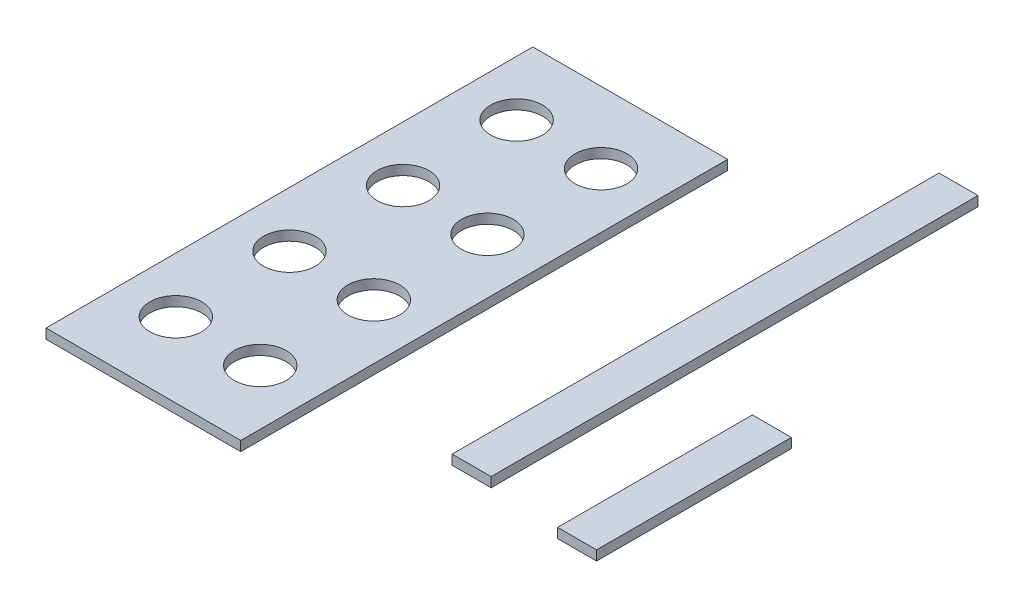
ISO-10303-21;
HEADER;
FILE_DESCRIPTION(('STEP AP214'),'2;1');
FILE_NAME('part.step','',(''),(''),'','','');
FILE_SCHEMA(('AUTOMOTIVE_DESIGN { 1 0 10303 214 1 1 1 1 }'));
ENDSEC;
DATA;
#1=APPLICATION_CONTEXT('core data for automotive mechanical design processes');
#2=APPLICATION_PROTOCOL_DEFINITION('international standard','automotive_design',2000,#1);
#3=PRODUCT_CONTEXT('',#1,'mechanical');
#4=PRODUCT('Part','Part','',(#3));
#5=PRODUCT_RELATED_PRODUCT_CATEGORY('part','',(#4));
#6=PRODUCT_DEFINITION_FORMATION('','',#4);
#7=PRODUCT_DEFINITION_CONTEXT('part definition',#1,'design');
#8=PRODUCT_DEFINITION('design','',#6,#7);
#9=PRODUCT_DEFINITION_SHAPE('','',#8);
#10=(LENGTH_UNIT() NAMED_UNIT(*) SI_UNIT(.MILLI.,.METRE.));
#11=(NAMED_UNIT(*) PLANE_ANGLE_UNIT() SI_UNIT($,.RADIAN.));
#12=(NAMED_UNIT(*) SI_UNIT($,.STERADIAN.) SOLID_ANGLE_UNIT());
#13=UNCERTAINTY_MEASURE_WITH_UNIT(LENGTH_MEASURE(1.E-05),#10,'distance_accuracy_value','');
#14=(GEOMETRIC_REPRESENTATION_CONTEXT(3) GLOBAL_UNCERTAINTY_ASSIGNED_CONTEXT((#13)) GLOBAL_UNIT_ASSIGNED_CONTEXT((#10,
#11,#12)) REPRESENTATION_CONTEXT('',''));
#15=CARTESIAN_POINT('',(0.,0.,0.));
#16=DIRECTION('',(0.,0.,1.));
#17=DIRECTION('',(1.,0.,0.));
#18=AXIS2_PLACEMENT_3D('',#15,#16,#17);
#19=CARTESIAN_POINT('',(93.6295601744686,3.,-73.2668198204584));
#20=DIRECTION('',(1.,0.,0.));
#21=DIRECTION('',(0.,0.,-1.));
#22=AXIS2_PLACEMENT_3D('',#19,#20,#21);
#23=PLANE('',#22);
#24=DIRECTION('',(0.,0.,1.));
#25=VECTOR('',#24,1.);
#26=CARTESIAN_POINT('',(93.6295601744686,0.,-73.2668198204584));
#27=LINE('',#26,#25);
#28=CARTESIAN_POINT('',(93.6295601744686,0.,-73.2668198204584));
#29=VERTEX_POINT('',#28);
#30=CARTESIAN_POINT('',(93.6295601744686,0.,-13.2668198204584));
#31=VERTEX_POINT('',#30);
#32=EDGE_CURVE('E107',#29,#31,#27,.T.);
#33=ORIENTED_EDGE('',*,*,#32,.T.);
#34=DIRECTION('',(0.,-1.,0.));
#35=VECTOR('',#34,1.);
#36=CARTESIAN_POINT('',(93.6295601744686,3.,-13.2668198204584));
#37=LINE('',#36,#35);
#38=CARTESIAN_POINT('',(93.6295601744686,3.,-13.2668198204584));
#39=VERTEX_POINT('',#38);
#40=EDGE_CURVE('E12',#39,#31,#37,.T.);
#41=ORIENTED_EDGE('',*,*,#40,.F.);
#42=DIRECTION('',(0.,0.,1.));
#43=VECTOR('',#42,1.);
#44=CARTESIAN_POINT('',(93.6295601744686,3.,-73.2668198204584));
#45=LINE('',#44,#43);
#46=CARTESIAN_POINT('',(93.6295601744686,3.,-73.2668198204584));
#47=VERTEX_POINT('',#46);
#48=EDGE_CURVE('E95',#47,#39,#45,.T.);
#49=ORIENTED_EDGE('',*,*,#48,.F.);
#50=DIRECTION('',(0.,-1.,0.));
#51=VECTOR('',#50,1.);
#52=CARTESIAN_POINT('',(93.6295601744686,3.,-73.2668198204584));
#53=LINE('',#52,#51);
#54=EDGE_CURVE('E103',#47,#29,#53,.T.);
#55=ORIENTED_EDGE('',*,*,#54,.T.);
#56=EDGE_LOOP('',(#33,#41,#49,#55));
#57=FACE_BOUND('',#56,.T.);
#58=ADVANCED_FACE('F44',(#57),#23,.F.);
#59=CARTESIAN_POINT('',(93.6295601744686,3.,-13.2668198204584));
#60=DIRECTION('',(0.,0.,-1.));
#61=DIRECTION('',(-1.,0.,0.));
#62=AXIS2_PLACEMENT_3D('',#59,#60,#61);
#63=PLANE('',#62);
#64=DIRECTION('',(1.,0.,0.));
#65=VECTOR('',#64,1.);
#66=CARTESIAN_POINT('',(93.6295601744686,0.,-13.2668198204584));
#67=LINE('',#66,#65);
#68=CARTESIAN_POINT('',(105.629560174469,0.,-13.2668198204584));
#69=VERTEX_POINT('',#68);
#70=EDGE_CURVE('E99',#31,#69,#67,.T.);
#71=ORIENTED_EDGE('',*,*,#70,.T.);
#72=DIRECTION('',(0.,-1.,0.));
#73=VECTOR('',#72,1.);
#74=CARTESIAN_POINT('',(105.629560174469,3.,-13.2668198204584));
#75=LINE('',#74,#73);
#76=CARTESIAN_POINT('',(105.629560174469,3.,-13.2668198204584));
#77=VERTEX_POINT('',#76);
#78=EDGE_CURVE('E52',#77,#69,#75,.T.);
#79=ORIENTED_EDGE('',*,*,#78,.F.);
#80=DIRECTION('',(1.,0.,0.));
#81=VECTOR('',#80,1.);
#82=CARTESIAN_POINT('',(93.6295601744686,3.,-13.2668198204584));
#83=LINE('',#82,#81);
#84=EDGE_CURVE('E90',#39,#77,#83,.T.);
#85=ORIENTED_EDGE('',*,*,#84,.F.);
#86=ORIENTED_EDGE('',*,*,#40,.T.);
#87=EDGE_LOOP('',(#71,#79,#85,#86));
#88=FACE_BOUND('',#87,.T.);
#89=ADVANCED_FACE('F98',(#88),#63,.F.);
#90=CARTESIAN_POINT('',(105.629560174469,3.,-73.2668198204584));
#91=DIRECTION('',(-1.,0.,0.));
#92=DIRECTION('',(0.,0.,1.));
#93=AXIS2_PLACEMENT_3D('',#90,#91,#92);
#94=PLANE('',#93);
#95=DIRECTION('',(0.,0.,-1.));
#96=VECTOR('',#95,1.);
#97=CARTESIAN_POINT('',(105.629560174469,0.,-73.2668198204584));
#98=LINE('',#97,#96);
#99=CARTESIAN_POINT('',(105.629560174469,0.,-73.2668198204584));
#100=VERTEX_POINT('',#99);
#101=EDGE_CURVE('E77',#69,#100,#98,.T.);
#102=ORIENTED_EDGE('',*,*,#101,.T.);
#103=DIRECTION('',(0.,-1.,0.));
#104=VECTOR('',#103,1.);
#105=CARTESIAN_POINT('',(105.629560174469,3.,-73.2668198204584));
#106=LINE('',#105,#104);
#107=CARTESIAN_POINT('',(105.629560174469,3.,-73.2668198204584));
#108=VERTEX_POINT('',#107);
#109=EDGE_CURVE('E100',#108,#100,#106,.T.);
#110=ORIENTED_EDGE('',*,*,#109,.F.);
#111=DIRECTION('',(0.,0.,-1.));
#112=VECTOR('',#111,1.);
#113=CARTESIAN_POINT('',(105.629560174469,3.,-73.2668198204584));
#114=LINE('',#113,#112);
#115=EDGE_CURVE('E93',#77,#108,#114,.T.);
#116=ORIENTED_EDGE('',*,*,#115,.F.);
#117=ORIENTED_EDGE('',*,*,#78,.T.);
#118=EDGE_LOOP('',(#102,#110,#116,#117));
#119=FACE_BOUND('',#118,.T.);
#120=ADVANCED_FACE('F101',(#119),#94,.F.);
#121=CARTESIAN_POINT('',(93.6295601744686,3.,-73.2668198204584));
#122=DIRECTION('',(0.,0.,1.));
#123=DIRECTION('',(1.,0.,0.));
#124=AXIS2_PLACEMENT_3D('',#121,#122,#123);
#125=PLANE('',#124);
#126=DIRECTION('',(-1.,0.,0.));
#127=VECTOR('',#126,1.);
#128=CARTESIAN_POINT('',(93.6295601744686,0.,-73.2668198204584));
#129=LINE('',#128,#127);
#130=EDGE_CURVE('E83',#100,#29,#129,.T.);
#131=ORIENTED_EDGE('',*,*,#130,.T.);
#132=ORIENTED_EDGE('',*,*,#54,.F.);
#133=DIRECTION('',(-1.,0.,0.));
#134=VECTOR('',#133,1.);
#135=CARTESIAN_POINT('',(93.6295601744686,3.,-73.2668198204584));
#136=LINE('',#135,#134);
#137=EDGE_CURVE('E60',#108,#47,#136,.T.);
#138=ORIENTED_EDGE('',*,*,#137,.F.);
#139=ORIENTED_EDGE('',*,*,#109,.T.);
#140=EDGE_LOOP('',(#131,#132,#138,#139));
#141=FACE_BOUND('',#140,.T.);
#142=ADVANCED_FACE('F114',(#141),#125,.F.);
#143=CARTESIAN_POINT('',(0.,3.,0.));
#144=DIRECTION('',(0.,1.,0.));
#145=DIRECTION('',(0.,0.,1.));
#146=AXIS2_PLACEMENT_3D('',#143,#144,#145);
#147=PLANE('',#146);
#148=ORIENTED_EDGE('',*,*,#48,.T.);
#149=ORIENTED_EDGE('',*,*,#84,.T.);
#150=ORIENTED_EDGE('',*,*,#115,.T.);
#151=ORIENTED_EDGE('',*,*,#137,.T.);
#152=EDGE_LOOP('',(#148,#149,#150,#151));
#153=FACE_BOUND('',#152,.T.);
#154=ADVANCED_FACE('F91',(#153),#147,.T.);
#155=CARTESIAN_POINT('',(0.,0.,0.));
#156=DIRECTION('',(0.,1.,0.));
#157=DIRECTION('',(0.,0.,1.));
#158=AXIS2_PLACEMENT_3D('',#155,#156,#157);
#159=PLANE('',#158);
#160=ORIENTED_EDGE('',*,*,#32,.F.);
#161=ORIENTED_EDGE('',*,*,#130,.F.);
#162=ORIENTED_EDGE('',*,*,#101,.F.);
#163=ORIENTED_EDGE('',*,*,#70,.F.);
#164=EDGE_LOOP('',(#160,#161,#162,#163));
#165=FACE_BOUND('',#164,.T.);
#166=ADVANCED_FACE('F117',(#165),#159,.F.);
#167=CLOSED_SHELL('',(#58,#89,#120,#142,#154,#166));
#168=MANIFOLD_SOLID_BREP('B2',#167);
#169=CARTESIAN_POINT('',(57.8362578566196,3.,-166.571847269674));
#170=DIRECTION('',(1.,0.,0.));
#171=DIRECTION('',(0.,0.,-1.));
#172=AXIS2_PLACEMENT_3D('',#169,#170,#171);
#173=PLANE('',#172);
#174=DIRECTION('',(0.,0.,1.));
#175=VECTOR('',#174,1.);
#176=CARTESIAN_POINT('',(57.8362578566196,0.,-166.571847269674));
#177=LINE('',#176,#175);
#178=CARTESIAN_POINT('',(57.8362578566196,0.,-166.571847269674));
#179=VERTEX_POINT('',#178);
#180=CARTESIAN_POINT('',(57.8362578566196,0.,-16.5718472696739));
#181=VERTEX_POINT('',#180);
#182=EDGE_CURVE('E240',#179,#181,#177,.T.);
#183=ORIENTED_EDGE('',*,*,#182,.T.);
#184=DIRECTION('',(0.,-1.,0.));
#185=VECTOR('',#184,1.);
#186=CARTESIAN_POINT('',(57.8362578566196,3.,-16.5718472696739));
#187=LINE('',#186,#185);
#188=CARTESIAN_POINT('',(57.8362578566196,3.,-16.5718472696739));
#189=VERTEX_POINT('',#188);
#190=EDGE_CURVE('E42',#189,#181,#187,.T.);
#191=ORIENTED_EDGE('',*,*,#190,.F.);
#192=DIRECTION('',(0.,0.,1.));
#193=VECTOR('',#192,1.);
#194=CARTESIAN_POINT('',(57.8362578566196,3.,-166.571847269674));
#195=LINE('',#194,#193);
#196=CARTESIAN_POINT('',(57.8362578566196,3.,-166.571847269674));
#197=VERTEX_POINT('',#196);
#198=EDGE_CURVE('E228',#197,#189,#195,.T.);
#199=ORIENTED_EDGE('',*,*,#198,.F.);
#200=DIRECTION('',(0.,-1.,0.));
#201=VECTOR('',#200,1.);
#202=CARTESIAN_POINT('',(57.8362578566196,3.,-166.571847269674));
#203=LINE('',#202,#201);
#204=EDGE_CURVE('E236',#197,#179,#203,.T.);
#205=ORIENTED_EDGE('',*,*,#204,.T.);
#206=EDGE_LOOP('',(#183,#191,#199,#205));
#207=FACE_BOUND('',#206,.T.);
#208=ADVANCED_FACE('F177',(#207),#173,.F.);
#209=CARTESIAN_POINT('',(57.8362578566196,3.,-16.5718472696739));
#210=DIRECTION('',(0.,0.,-1.));
#211=DIRECTION('',(-1.,0.,0.));
#212=AXIS2_PLACEMENT_3D('',#209,#210,#211);
#213=PLANE('',#212);
#214=DIRECTION('',(1.,0.,0.));
#215=VECTOR('',#214,1.);
#216=CARTESIAN_POINT('',(57.8362578566196,0.,-16.5718472696739));
#217=LINE('',#216,#215);
#218=CARTESIAN_POINT('',(69.8362578566196,0.,-16.5718472696739));
#219=VERTEX_POINT('',#218);
#220=EDGE_CURVE('E232',#181,#219,#217,.T.);
#221=ORIENTED_EDGE('',*,*,#220,.T.);
#222=DIRECTION('',(0.,-1.,0.));
#223=VECTOR('',#222,1.);
#224=CARTESIAN_POINT('',(69.8362578566196,3.,-16.5718472696739));
#225=LINE('',#224,#223);
#226=CARTESIAN_POINT('',(69.8362578566196,3.,-16.5718472696739));
#227=VERTEX_POINT('',#226);
#228=EDGE_CURVE('E185',#227,#219,#225,.T.);
#229=ORIENTED_EDGE('',*,*,#228,.F.);
#230=DIRECTION('',(1.,0.,0.));
#231=VECTOR('',#230,1.);
#232=CARTESIAN_POINT('',(57.8362578566196,3.,-16.5718472696739));
#233=LINE('',#232,#231);
#234=EDGE_CURVE('E223',#189,#227,#233,.T.);
#235=ORIENTED_EDGE('',*,*,#234,.F.);
#236=ORIENTED_EDGE('',*,*,#190,.T.);
#237=EDGE_LOOP('',(#221,#229,#235,#236));
#238=FACE_BOUND('',#237,.T.);
#239=ADVANCED_FACE('F231',(#238),#213,.F.);
#240=CARTESIAN_POINT('',(69.8362578566196,3.,-166.571847269674));
#241=DIRECTION('',(-1.,0.,0.));
#242=DIRECTION('',(0.,0.,1.));
#243=AXIS2_PLACEMENT_3D('',#240,#241,#242);
#244=PLANE('',#243);
#245=DIRECTION('',(0.,0.,-1.));
#246=VECTOR('',#245,1.);
#247=CARTESIAN_POINT('',(69.8362578566196,0.,-166.571847269674));
#248=LINE('',#247,#246);
#249=CARTESIAN_POINT('',(69.8362578566196,0.,-166.571847269674));
#250=VERTEX_POINT('',#249);
#251=EDGE_CURVE('E210',#219,#250,#248,.T.);
#252=ORIENTED_EDGE('',*,*,#251,.T.);
#253=DIRECTION('',(0.,-1.,0.));
#254=VECTOR('',#253,1.);
#255=CARTESIAN_POINT('',(69.8362578566196,3.,-166.571847269674));
#256=LINE('',#255,#254);
#257=CARTESIAN_POINT('',(69.8362578566196,3.,-166.571847269674));
#258=VERTEX_POINT('',#257);
#259=EDGE_CURVE('E233',#258,#250,#256,.T.);
#260=ORIENTED_EDGE('',*,*,#259,.F.);
#261=DIRECTION('',(0.,0.,-1.));
#262=VECTOR('',#261,1.);
#263=CARTESIAN_POINT('',(69.8362578566196,3.,-166.571847269674));
#264=LINE('',#263,#262);
#265=EDGE_CURVE('E226',#227,#258,#264,.T.);
#266=ORIENTED_EDGE('',*,*,#265,.F.);
#267=ORIENTED_EDGE('',*,*,#228,.T.);
#268=EDGE_LOOP('',(#252,#260,#266,#267));
#269=FACE_BOUND('',#268,.T.);
#270=ADVANCED_FACE('F234',(#269),#244,.F.);
#271=CARTESIAN_POINT('',(57.8362578566196,3.,-166.571847269674));
#272=DIRECTION('',(0.,0.,1.));
#273=DIRECTION('',(1.,0.,0.));
#274=AXIS2_PLACEMENT_3D('',#271,#272,#273);
#275=PLANE('',#274);
#276=DIRECTION('',(-1.,0.,0.));
#277=VECTOR('',#276,1.);
#278=CARTESIAN_POINT('',(57.8362578566196,0.,-166.571847269674));
#279=LINE('',#278,#277);
#280=EDGE_CURVE('E216',#250,#179,#279,.T.);
#281=ORIENTED_EDGE('',*,*,#280,.T.);
#282=ORIENTED_EDGE('',*,*,#204,.F.);
#283=DIRECTION('',(-1.,0.,0.));
#284=VECTOR('',#283,1.);
#285=CARTESIAN_POINT('',(57.8362578566196,3.,-166.571847269674));
#286=LINE('',#285,#284);
#287=EDGE_CURVE('E193',#258,#197,#286,.T.);
#288=ORIENTED_EDGE('',*,*,#287,.F.);
#289=ORIENTED_EDGE('',*,*,#259,.T.);
#290=EDGE_LOOP('',(#281,#282,#288,#289));
#291=FACE_BOUND('',#290,.T.);
#292=ADVANCED_FACE('F247',(#291),#275,.F.);
#293=CARTESIAN_POINT('',(0.,3.,0.));
#294=DIRECTION('',(0.,1.,0.));
#295=DIRECTION('',(0.,0.,1.));
#296=AXIS2_PLACEMENT_3D('',#293,#294,#295);
#297=PLANE('',#296);
#298=ORIENTED_EDGE('',*,*,#198,.T.);
#299=ORIENTED_EDGE('',*,*,#234,.T.);
#300=ORIENTED_EDGE('',*,*,#265,.T.);
#301=ORIENTED_EDGE('',*,*,#287,.T.);
#302=EDGE_LOOP('',(#298,#299,#300,#301));
#303=FACE_BOUND('',#302,.T.);
#304=ADVANCED_FACE('F224',(#303),#297,.T.);
#305=CARTESIAN_POINT('',(0.,0.,0.));
#306=DIRECTION('',(0.,1.,0.));
#307=DIRECTION('',(0.,0.,1.));
#308=AXIS2_PLACEMENT_3D('',#305,#306,#307);
#309=PLANE('',#308);
#310=ORIENTED_EDGE('',*,*,#182,.F.);
#311=ORIENTED_EDGE('',*,*,#280,.F.);
#312=ORIENTED_EDGE('',*,*,#251,.F.);
#313=ORIENTED_EDGE('',*,*,#220,.F.);
#314=EDGE_LOOP('',(#310,#311,#312,#313));
#315=FACE_BOUND('',#314,.T.);
#316=ADVANCED_FACE('F250',(#315),#309,.F.);
#317=CLOSED_SHELL('',(#208,#239,#270,#292,#304,#316));
#318=MANIFOLD_SOLID_BREP('B6',#317);
#319=CARTESIAN_POINT('',(-38.3775351014041,3.,-137.644305772231));
#320=DIRECTION('',(1.,0.,0.));
#321=DIRECTION('',(0.,0.,-1.));
#322=AXIS2_PLACEMENT_3D('',#319,#320,#321);
#323=PLANE('',#322);
#324=DIRECTION('',(0.,0.,1.));
#325=VECTOR('',#324,1.);
#326=CARTESIAN_POINT('',(-38.3775351014041,0.,-137.644305772231));
#327=LINE('',#326,#325);
#328=CARTESIAN_POINT('',(-38.3775351014041,0.,-137.644305772231));
#329=VERTEX_POINT('',#328);
#330=CARTESIAN_POINT('',(-38.3775351014041,0.,12.3556942277691));
#331=VERTEX_POINT('',#330);
#332=EDGE_CURVE('E370',#329,#331,#327,.T.);
#333=ORIENTED_EDGE('',*,*,#332,.T.);
#334=DIRECTION('',(0.,-1.,0.));
#335=VECTOR('',#334,1.);
#336=CARTESIAN_POINT('',(-38.3775351014041,3.,12.3556942277691));
#337=LINE('',#336,#335);
#338=CARTESIAN_POINT('',(-38.3775351014041,3.,12.3556942277691));
#339=VERTEX_POINT('',#338);
#340=EDGE_CURVE('E175',#339,#331,#337,.T.);
#341=ORIENTED_EDGE('',*,*,#340,.F.);
#342=DIRECTION('',(0.,0.,1.));
#343=VECTOR('',#342,1.);
#344=CARTESIAN_POINT('',(-38.3775351014041,3.,-137.644305772231));
#345=LINE('',#344,#343);
#346=CARTESIAN_POINT('',(-38.3775351014041,3.,-137.644305772231));
#347=VERTEX_POINT('',#346);
#348=EDGE_CURVE('E358',#347,#339,#345,.T.);
#349=ORIENTED_EDGE('',*,*,#348,.F.);
#350=DIRECTION('',(0.,-1.,0.));
#351=VECTOR('',#350,1.);
#352=CARTESIAN_POINT('',(-38.3775351014041,3.,-137.644305772231));
#353=LINE('',#352,#351);
#354=EDGE_CURVE('E366',#347,#329,#353,.T.);
#355=ORIENTED_EDGE('',*,*,#354,.T.);
#356=EDGE_LOOP('',(#333,#341,#349,#355));
#357=FACE_BOUND('',#356,.T.);
#358=ADVANCED_FACE('F307',(#357),#323,.F.);
#359=CARTESIAN_POINT('',(-38.3775351014041,3.,12.3556942277691));
#360=DIRECTION('',(0.,0.,-1.));
#361=DIRECTION('',(-1.,0.,0.));
#362=AXIS2_PLACEMENT_3D('',#359,#360,#361);
#363=PLANE('',#362);
#364=DIRECTION('',(1.,0.,0.));
#365=VECTOR('',#364,1.);
#366=CARTESIAN_POINT('',(-38.3775351014041,0.,12.3556942277691));
#367=LINE('',#366,#365);
#368=CARTESIAN_POINT('',(21.6224648985959,0.,12.3556942277691));
#369=VERTEX_POINT('',#368);
#370=EDGE_CURVE('E362',#331,#369,#367,.T.);
#371=ORIENTED_EDGE('',*,*,#370,.T.);
#372=DIRECTION('',(0.,-1.,0.));
#373=VECTOR('',#372,1.);
#374=CARTESIAN_POINT('',(21.6224648985959,3.,12.3556942277691));
#375=LINE('',#374,#373);
#376=CARTESIAN_POINT('',(21.6224648985959,3.,12.3556942277691));
#377=VERTEX_POINT('',#376);
#378=EDGE_CURVE('E315',#377,#369,#375,.T.);
#379=ORIENTED_EDGE('',*,*,#378,.F.);
#380=DIRECTION('',(1.,0.,0.));
#381=VECTOR('',#380,1.);
#382=CARTESIAN_POINT('',(-38.3775351014041,3.,12.3556942277691));
#383=LINE('',#382,#381);
#384=EDGE_CURVE('E353',#339,#377,#383,.T.);
#385=ORIENTED_EDGE('',*,*,#384,.F.);
#386=ORIENTED_EDGE('',*,*,#340,.T.);
#387=EDGE_LOOP('',(#371,#379,#385,#386));
#388=FACE_BOUND('',#387,.T.);
#389=ADVANCED_FACE('F361',(#388),#363,.F.);
#390=CARTESIAN_POINT('',(21.6224648985959,3.,-137.644305772231));
#391=DIRECTION('',(-1.,0.,0.));
#392=DIRECTION('',(0.,0.,1.));
#393=AXIS2_PLACEMENT_3D('',#390,#391,#392);
#394=PLANE('',#393);
#395=DIRECTION('',(0.,0.,-1.));
#396=VECTOR('',#395,1.);
#397=CARTESIAN_POINT('',(21.6224648985959,0.,-137.644305772231));
#398=LINE('',#397,#396);
#399=CARTESIAN_POINT('',(21.6224648985959,0.,-137.644305772231));
#400=VERTEX_POINT('',#399);
#401=EDGE_CURVE('E340',#369,#400,#398,.T.);
#402=ORIENTED_EDGE('',*,*,#401,.T.);
#403=DIRECTION('',(0.,-1.,0.));
#404=VECTOR('',#403,1.);
#405=CARTESIAN_POINT('',(21.6224648985959,3.,-137.644305772231));
#406=LINE('',#405,#404);
#407=CARTESIAN_POINT('',(21.6224648985959,3.,-137.644305772231));
#408=VERTEX_POINT('',#407);
#409=EDGE_CURVE('E363',#408,#400,#406,.T.);
#410=ORIENTED_EDGE('',*,*,#409,.F.);
#411=DIRECTION('',(0.,0.,-1.));
#412=VECTOR('',#411,1.);
#413=CARTESIAN_POINT('',(21.6224648985959,3.,-137.644305772231));
#414=LINE('',#413,#412);
#415=EDGE_CURVE('E356',#377,#408,#414,.T.);
#416=ORIENTED_EDGE('',*,*,#415,.F.);
#417=ORIENTED_EDGE('',*,*,#378,.T.);
#418=EDGE_LOOP('',(#402,#410,#416,#417));
#419=FACE_BOUND('',#418,.T.);
#420=ADVANCED_FACE('F364',(#419),#394,.F.);
#421=CARTESIAN_POINT('',(-38.3775351014041,3.,-137.644305772231));
#422=DIRECTION('',(0.,0.,1.));
#423=DIRECTION('',(1.,0.,0.));
#424=AXIS2_PLACEMENT_3D('',#421,#422,#423);
#425=PLANE('',#424);
#426=DIRECTION('',(-1.,0.,0.));
#427=VECTOR('',#426,1.);
#428=CARTESIAN_POINT('',(-38.3775351014041,0.,-137.644305772231));
#429=LINE('',#428,#427);
#430=EDGE_CURVE('E346',#400,#329,#429,.T.);
#431=ORIENTED_EDGE('',*,*,#430,.T.);
#432=ORIENTED_EDGE('',*,*,#354,.F.);
#433=DIRECTION('',(-1.,0.,0.));
#434=VECTOR('',#433,1.);
#435=CARTESIAN_POINT('',(-38.3775351014041,3.,-137.644305772231));
#436=LINE('',#435,#434);
#437=EDGE_CURVE('E323',#408,#347,#436,.T.);
#438=ORIENTED_EDGE('',*,*,#437,.F.);
#439=ORIENTED_EDGE('',*,*,#409,.T.);
#440=EDGE_LOOP('',(#431,#432,#438,#439));
#441=FACE_BOUND('',#440,.T.);
#442=ADVANCED_FACE('F378',(#441),#425,.F.);
#443=CARTESIAN_POINT('',(0.,3.,0.));
#444=DIRECTION('',(0.,1.,0.));
#445=DIRECTION('',(0.,0.,1.));
#446=AXIS2_PLACEMENT_3D('',#443,#444,#445);
#447=PLANE('',#446);
#448=CARTESIAN_POINT('',(4.62246489859569,3.,-80.6443057722309));
#449=DIRECTION('',(0.,1.,0.));
#450=DIRECTION('',(0.,0.,1.));
#451=AXIS2_PLACEMENT_3D('',#448,#449,#450);
#452=CIRCLE('',#451,8.);
#453=CARTESIAN_POINT('',(4.62246489859569,3.,-72.6443057722309));
#454=VERTEX_POINT('',#453);
#455=EDGE_CURVE('E402',#454,#454,#452,.T.);
#456=ORIENTED_EDGE('',*,*,#455,.F.);
#457=EDGE_LOOP('',(#456));
#458=FACE_BOUND('',#457,.T.);
#459=CARTESIAN_POINT('',(-21.3775351014042,3.,-45.6443057722309));
#460=DIRECTION('',(0.,1.,0.));
#461=DIRECTION('',(0.,0.,1.));
#462=AXIS2_PLACEMENT_3D('',#459,#460,#461);
#463=CIRCLE('',#462,8.);
#464=CARTESIAN_POINT('',(-21.3775351014042,3.,-37.6443057722309));
#465=VERTEX_POINT('',#464);
#466=EDGE_CURVE('E409',#465,#465,#463,.T.);
#467=ORIENTED_EDGE('',*,*,#466,.F.);
#468=EDGE_LOOP('',(#467));
#469=FACE_BOUND('',#468,.T.);
#470=CARTESIAN_POINT('',(4.62246489859581,3.,-45.6443057722309));
#471=DIRECTION('',(0.,1.,0.));
#472=DIRECTION('',(0.,0.,1.));
#473=AXIS2_PLACEMENT_3D('',#470,#471,#472);
#474=CIRCLE('',#473,8.);
#475=CARTESIAN_POINT('',(4.62246489859581,3.,-37.6443057722309));
#476=VERTEX_POINT('',#475);
#477=EDGE_CURVE('E390',#476,#476,#474,.T.);
#478=ORIENTED_EDGE('',*,*,#477,.F.);
#479=EDGE_LOOP('',(#478));
#480=FACE_BOUND('',#479,.T.);
#481=CARTESIAN_POINT('',(-21.3775351014041,3.,-10.6443057722309));
#482=DIRECTION('',(0.,1.,0.));
#483=DIRECTION('',(0.,0.,1.));
#484=AXIS2_PLACEMENT_3D('',#481,#482,#483);
#485=CIRCLE('',#484,8.);
#486=CARTESIAN_POINT('',(-21.3775351014041,3.,-2.64430577223089));
#487=VERTEX_POINT('',#486);
#488=EDGE_CURVE('E397',#487,#487,#485,.T.);
#489=ORIENTED_EDGE('',*,*,#488,.F.);
#490=EDGE_LOOP('',(#489));
#491=FACE_BOUND('',#490,.T.);
#492=CARTESIAN_POINT('',(-21.3775351014044,3.,-115.644305772231));
#493=DIRECTION('',(0.,1.,0.));
#494=DIRECTION('',(0.,0.,1.));
#495=AXIS2_PLACEMENT_3D('',#492,#493,#494);
#496=CIRCLE('',#495,8.00000000000001);
#497=CARTESIAN_POINT('',(-21.3775351014044,3.,-107.644305772231));
#498=VERTEX_POINT('',#497);
#499=EDGE_CURVE('E426',#498,#498,#496,.T.);
#500=ORIENTED_EDGE('',*,*,#499,.F.);
#501=EDGE_LOOP('',(#500));
#502=FACE_BOUND('',#501,.T.);
#503=CARTESIAN_POINT('',(4.62246489859557,3.,-115.644305772231));
#504=DIRECTION('',(0.,1.,0.));
#505=DIRECTION('',(0.,0.,1.));
#506=AXIS2_PLACEMENT_3D('',#503,#504,#505);
#507=CIRCLE('',#506,8.);
#508=CARTESIAN_POINT('',(4.62246489859557,3.,-107.644305772231));
#509=VERTEX_POINT('',#508);
#510=EDGE_CURVE('E414',#509,#509,#507,.T.);
#511=ORIENTED_EDGE('',*,*,#510,.F.);
#512=EDGE_LOOP('',(#511));
#513=FACE_BOUND('',#512,.T.);
#514=CARTESIAN_POINT('',(-21.3775351014043,3.,-80.6443057722309));
#515=DIRECTION('',(0.,1.,0.));
#516=DIRECTION('',(0.,0.,1.));
#517=AXIS2_PLACEMENT_3D('',#514,#515,#516);
#518=CIRCLE('',#517,8.);
#519=CARTESIAN_POINT('',(-21.3775351014043,3.,-72.6443057722309));
#520=VERTEX_POINT('',#519);
#521=EDGE_CURVE('E421',#520,#520,#518,.T.);
#522=ORIENTED_EDGE('',*,*,#521,.F.);
#523=EDGE_LOOP('',(#522));
#524=FACE_BOUND('',#523,.T.);
#525=CARTESIAN_POINT('',(4.62246489859593,3.,-10.6443057722309));
#526=DIRECTION('',(0.,1.,0.));
#527=DIRECTION('',(0.,0.,1.));
#528=AXIS2_PLACEMENT_3D('',#525,#526,#527);
#529=CIRCLE('',#528,8.);
#530=CARTESIAN_POINT('',(4.62246489859593,3.,-2.64430577223089));
#531=VERTEX_POINT('',#530);
#532=EDGE_CURVE('E384',#531,#531,#529,.T.);
#533=ORIENTED_EDGE('',*,*,#532,.F.);
#534=EDGE_LOOP('',(#533));
#535=FACE_BOUND('',#534,.T.);
#536=ORIENTED_EDGE('',*,*,#348,.T.);
#537=ORIENTED_EDGE('',*,*,#384,.T.);
#538=ORIENTED_EDGE('',*,*,#415,.T.);
#539=ORIENTED_EDGE('',*,*,#437,.T.);
#540=EDGE_LOOP('',(#536,#537,#538,#539));
#541=FACE_BOUND('',#540,.T.);
#542=ADVANCED_FACE('F354',(#458,#469,#480,#491,#502,#513,#524,#535,#541),#447,.T.);
#543=CARTESIAN_POINT('',(0.,0.,0.));
#544=DIRECTION('',(0.,1.,0.));
#545=DIRECTION('',(0.,0.,1.));
#546=AXIS2_PLACEMENT_3D('',#543,#544,#545);
#547=PLANE('',#546);
#548=CARTESIAN_POINT('',(4.62246489859569,0.,-80.6443057722309));
#549=DIRECTION('',(0.,1.,0.));
#550=DIRECTION('',(0.,0.,1.));
#551=AXIS2_PLACEMENT_3D('',#548,#549,#550);
#552=CIRCLE('',#551,8.);
#553=CARTESIAN_POINT('',(4.62246489859569,0.,-72.6443057722309));
#554=VERTEX_POINT('',#553);
#555=EDGE_CURVE('E405',#554,#554,#552,.T.);
#556=ORIENTED_EDGE('',*,*,#555,.T.);
#557=EDGE_LOOP('',(#556));
#558=FACE_BOUND('',#557,.T.);
#559=CARTESIAN_POINT('',(-21.3775351014042,0.,-45.6443057722309));
#560=DIRECTION('',(0.,1.,0.));
#561=DIRECTION('',(0.,0.,1.));
#562=AXIS2_PLACEMENT_3D('',#559,#560,#561);
#563=CIRCLE('',#562,8.);
#564=CARTESIAN_POINT('',(-21.3775351014042,0.,-37.6443057722309));
#565=VERTEX_POINT('',#564);
#566=EDGE_CURVE('E394',#565,#565,#563,.T.);
#567=ORIENTED_EDGE('',*,*,#566,.T.);
#568=EDGE_LOOP('',(#567));
#569=FACE_BOUND('',#568,.T.);
#570=CARTESIAN_POINT('',(4.62246489859581,0.,-45.6443057722309));
#571=DIRECTION('',(0.,1.,0.));
#572=DIRECTION('',(0.,0.,1.));
#573=AXIS2_PLACEMENT_3D('',#570,#571,#572);
#574=CIRCLE('',#573,8.);
#575=CARTESIAN_POINT('',(4.62246489859581,0.,-37.6443057722309));
#576=VERTEX_POINT('',#575);
#577=EDGE_CURVE('E393',#576,#576,#574,.T.);
#578=ORIENTED_EDGE('',*,*,#577,.T.);
#579=EDGE_LOOP('',(#578));
#580=FACE_BOUND('',#579,.T.);
#581=CARTESIAN_POINT('',(-21.3775351014041,0.,-10.6443057722309));
#582=DIRECTION('',(0.,1.,0.));
#583=DIRECTION('',(0.,0.,1.));
#584=AXIS2_PLACEMENT_3D('',#581,#582,#583);
#585=CIRCLE('',#584,8.);
#586=CARTESIAN_POINT('',(-21.3775351014041,0.,-2.64430577223089));
#587=VERTEX_POINT('',#586);
#588=EDGE_CURVE('E387',#587,#587,#585,.T.);
#589=ORIENTED_EDGE('',*,*,#588,.T.);
#590=EDGE_LOOP('',(#589));
#591=FACE_BOUND('',#590,.T.);
#592=CARTESIAN_POINT('',(-21.3775351014044,0.,-115.644305772231));
#593=DIRECTION('',(0.,1.,0.));
#594=DIRECTION('',(0.,0.,1.));
#595=AXIS2_PLACEMENT_3D('',#592,#593,#594);
#596=CIRCLE('',#595,8.00000000000001);
#597=CARTESIAN_POINT('',(-21.3775351014044,0.,-107.644305772231));
#598=VERTEX_POINT('',#597);
#599=EDGE_CURVE('E418',#598,#598,#596,.T.);
#600=ORIENTED_EDGE('',*,*,#599,.T.);
#601=EDGE_LOOP('',(#600));
#602=FACE_BOUND('',#601,.T.);
#603=CARTESIAN_POINT('',(4.62246489859557,0.,-115.644305772231));
#604=DIRECTION('',(0.,1.,0.));
#605=DIRECTION('',(0.,0.,1.));
#606=AXIS2_PLACEMENT_3D('',#603,#604,#605);
#607=CIRCLE('',#606,8.);
#608=CARTESIAN_POINT('',(4.62246489859557,0.,-107.644305772231));
#609=VERTEX_POINT('',#608);
#610=EDGE_CURVE('E417',#609,#609,#607,.T.);
#611=ORIENTED_EDGE('',*,*,#610,.T.);
#612=EDGE_LOOP('',(#611));
#613=FACE_BOUND('',#612,.T.);
#614=CARTESIAN_POINT('',(-21.3775351014043,0.,-80.6443057722309));
#615=DIRECTION('',(0.,1.,0.));
#616=DIRECTION('',(0.,0.,1.));
#617=AXIS2_PLACEMENT_3D('',#614,#615,#616);
#618=CIRCLE('',#617,8.);
#619=CARTESIAN_POINT('',(-21.3775351014043,0.,-72.6443057722309));
#620=VERTEX_POINT('',#619);
#621=EDGE_CURVE('E406',#620,#620,#618,.T.);
#622=ORIENTED_EDGE('',*,*,#621,.T.);
#623=EDGE_LOOP('',(#622));
#624=FACE_BOUND('',#623,.T.);
#625=CARTESIAN_POINT('',(4.62246489859593,0.,-10.6443057722309));
#626=DIRECTION('',(0.,1.,0.));
#627=DIRECTION('',(0.,0.,1.));
#628=AXIS2_PLACEMENT_3D('',#625,#626,#627);
#629=CIRCLE('',#628,8.);
#630=CARTESIAN_POINT('',(4.62246489859593,0.,-2.64430577223089));
#631=VERTEX_POINT('',#630);
#632=EDGE_CURVE('E373',#631,#631,#629,.T.);
#633=ORIENTED_EDGE('',*,*,#632,.T.);
#634=EDGE_LOOP('',(#633));
#635=FACE_BOUND('',#634,.T.);
#636=ORIENTED_EDGE('',*,*,#332,.F.);
#637=ORIENTED_EDGE('',*,*,#430,.F.);
#638=ORIENTED_EDGE('',*,*,#401,.F.);
#639=ORIENTED_EDGE('',*,*,#370,.F.);
#640=EDGE_LOOP('',(#636,#637,#638,#639));
#641=FACE_BOUND('',#640,.T.);
#642=ADVANCED_FACE('F381',(#558,#569,#580,#591,#602,#613,#624,#635,#641),#547,.F.);
#643=CARTESIAN_POINT('',(4.62246489859593,0.,-10.6443057722309));
#644=DIRECTION('',(0.,1.,0.));
#645=DIRECTION('',(0.,0.,1.));
#646=AXIS2_PLACEMENT_3D('',#643,#644,#645);
#647=CYLINDRICAL_SURFACE('',#646,8.);
#648=ORIENTED_EDGE('',*,*,#632,.F.);
#649=EDGE_LOOP('',(#648));
#650=FACE_BOUND('',#649,.T.);
#651=ORIENTED_EDGE('',*,*,#532,.T.);
#652=EDGE_LOOP('',(#651));
#653=FACE_BOUND('',#652,.T.);
#654=ADVANCED_FACE('F452',(#650,#653),#647,.F.);
#655=CARTESIAN_POINT('',(-21.3775351014043,0.,-80.6443057722309));
#656=DIRECTION('',(0.,1.,0.));
#657=DIRECTION('',(0.,0.,1.));
#658=AXIS2_PLACEMENT_3D('',#655,#656,#657);
#659=CYLINDRICAL_SURFACE('',#658,8.);
#660=ORIENTED_EDGE('',*,*,#621,.F.);
#661=EDGE_LOOP('',(#660));
#662=FACE_BOUND('',#661,.T.);
#663=ORIENTED_EDGE('',*,*,#521,.T.);
#664=EDGE_LOOP('',(#663));
#665=FACE_BOUND('',#664,.T.);
#666=ADVANCED_FACE('F454',(#662,#665),#659,.F.);
#667=CARTESIAN_POINT('',(4.62246489859557,0.,-115.644305772231));
#668=DIRECTION('',(0.,1.,0.));
#669=DIRECTION('',(0.,0.,1.));
#670=AXIS2_PLACEMENT_3D('',#667,#668,#669);
#671=CYLINDRICAL_SURFACE('',#670,8.);
#672=ORIENTED_EDGE('',*,*,#610,.F.);
#673=EDGE_LOOP('',(#672));
#674=FACE_BOUND('',#673,.T.);
#675=ORIENTED_EDGE('',*,*,#510,.T.);
#676=EDGE_LOOP('',(#675));
#677=FACE_BOUND('',#676,.T.);
#678=ADVANCED_FACE('F438',(#674,#677),#671,.F.);
#679=CARTESIAN_POINT('',(-21.3775351014044,0.,-115.644305772231));
#680=DIRECTION('',(0.,1.,0.));
#681=DIRECTION('',(0.,0.,1.));
#682=AXIS2_PLACEMENT_3D('',#679,#680,#681);
#683=CYLINDRICAL_SURFACE('',#682,8.00000000000001);
#684=ORIENTED_EDGE('',*,*,#599,.F.);
#685=EDGE_LOOP('',(#684));
#686=FACE_BOUND('',#685,.T.);
#687=ORIENTED_EDGE('',*,*,#499,.T.);
#688=EDGE_LOOP('',(#687));
#689=FACE_BOUND('',#688,.T.);
#690=ADVANCED_FACE('F434',(#686,#689),#683,.F.);
#691=CARTESIAN_POINT('',(-21.3775351014041,0.,-10.6443057722309));
#692=DIRECTION('',(0.,1.,0.));
#693=DIRECTION('',(0.,0.,1.));
#694=AXIS2_PLACEMENT_3D('',#691,#692,#693);
#695=CYLINDRICAL_SURFACE('',#694,8.);
#696=ORIENTED_EDGE('',*,*,#588,.F.);
#697=EDGE_LOOP('',(#696));
#698=FACE_BOUND('',#697,.T.);
#699=ORIENTED_EDGE('',*,*,#488,.T.);
#700=EDGE_LOOP('',(#699));
#701=FACE_BOUND('',#700,.T.);
#702=ADVANCED_FACE('F437',(#698,#701),#695,.F.);
#703=CARTESIAN_POINT('',(4.62246489859581,0.,-45.6443057722309));
#704=DIRECTION('',(0.,1.,0.));
#705=DIRECTION('',(0.,0.,1.));
#706=AXIS2_PLACEMENT_3D('',#703,#704,#705);
#707=CYLINDRICAL_SURFACE('',#706,8.);
#708=ORIENTED_EDGE('',*,*,#577,.F.);
#709=EDGE_LOOP('',(#708));
#710=FACE_BOUND('',#709,.T.);
#711=ORIENTED_EDGE('',*,*,#477,.T.);
#712=EDGE_LOOP('',(#711));
#713=FACE_BOUND('',#712,.T.);
#714=ADVANCED_FACE('F523',(#710,#713),#707,.F.);
#715=CARTESIAN_POINT('',(-21.3775351014042,0.,-45.6443057722309));
#716=DIRECTION('',(0.,1.,0.));
#717=DIRECTION('',(0.,0.,1.));
#718=AXIS2_PLACEMENT_3D('',#715,#716,#717);
#719=CYLINDRICAL_SURFACE('',#718,8.);
#720=ORIENTED_EDGE('',*,*,#566,.F.);
#721=EDGE_LOOP('',(#720));
#722=FACE_BOUND('',#721,.T.);
#723=ORIENTED_EDGE('',*,*,#466,.T.);
#724=EDGE_LOOP('',(#723));
#725=FACE_BOUND('',#724,.T.);
#726=ADVANCED_FACE('F533',(#722,#725),#719,.F.);
#727=CARTESIAN_POINT('',(4.62246489859569,0.,-80.6443057722309));
#728=DIRECTION('',(0.,1.,0.));
#729=DIRECTION('',(0.,0.,1.));
#730=AXIS2_PLACEMENT_3D('',#727,#728,#729);
#731=CYLINDRICAL_SURFACE('',#730,8.);
#732=ORIENTED_EDGE('',*,*,#555,.F.);
#733=EDGE_LOOP('',(#732));
#734=FACE_BOUND('',#733,.T.);
#735=ORIENTED_EDGE('',*,*,#455,.T.);
#736=EDGE_LOOP('',(#735));
#737=FACE_BOUND('',#736,.T.);
#738=ADVANCED_FACE('F542',(#734,#737),#731,.F.);
#739=CLOSED_SHELL('',(#358,#389,#420,#442,#542,#642,#654,#666,#678,#690,#702,#714,#726,#738));
#740=MANIFOLD_SOLID_BREP('B36',#739);
#741=ADVANCED_BREP_SHAPE_REPRESENTATION('',(#18,#168,#318,#740),#14);
#742=SHAPE_DEFINITION_REPRESENTATION(#9,#741);
ENDSEC;
END-ISO-10303-21;
